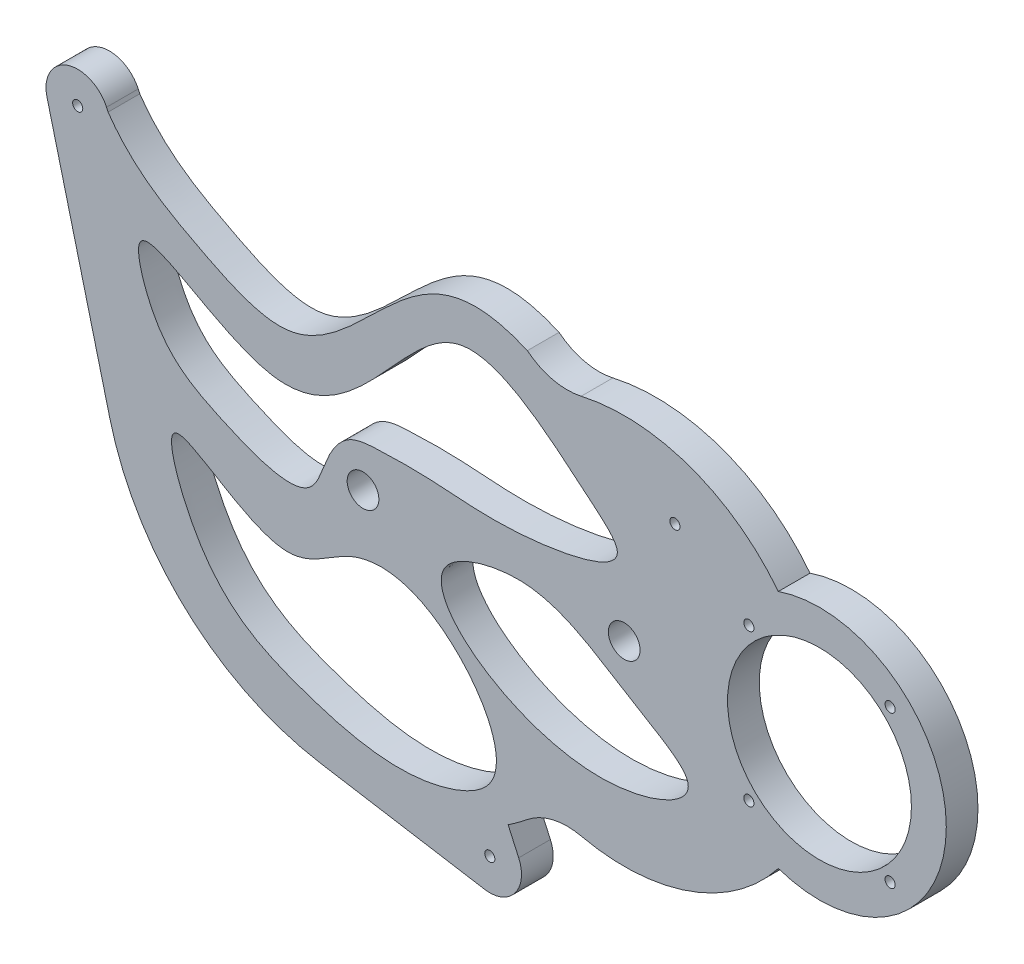
ISO-10303-21;
HEADER;
FILE_DESCRIPTION(('STEP AP214'),'2;1');
FILE_NAME('part.step','',(''),(''),'','','');
FILE_SCHEMA(('AUTOMOTIVE_DESIGN { 1 0 10303 214 1 1 1 1 }'));
ENDSEC;
DATA;
#1=APPLICATION_CONTEXT('core data for automotive mechanical design processes');
#2=APPLICATION_PROTOCOL_DEFINITION('international standard','automotive_design',2000,#1);
#3=PRODUCT_CONTEXT('',#1,'mechanical');
#4=PRODUCT('Part','Part','',(#3));
#5=PRODUCT_RELATED_PRODUCT_CATEGORY('part','',(#4));
#6=PRODUCT_DEFINITION_FORMATION('','',#4);
#7=PRODUCT_DEFINITION_CONTEXT('part definition',#1,'design');
#8=PRODUCT_DEFINITION('design','',#6,#7);
#9=PRODUCT_DEFINITION_SHAPE('','',#8);
#10=(LENGTH_UNIT() NAMED_UNIT(*) SI_UNIT(.MILLI.,.METRE.));
#11=(NAMED_UNIT(*) PLANE_ANGLE_UNIT() SI_UNIT($,.RADIAN.));
#12=(NAMED_UNIT(*) SI_UNIT($,.STERADIAN.) SOLID_ANGLE_UNIT());
#13=UNCERTAINTY_MEASURE_WITH_UNIT(LENGTH_MEASURE(1.E-05),#10,'distance_accuracy_value','');
#14=(GEOMETRIC_REPRESENTATION_CONTEXT(3) GLOBAL_UNCERTAINTY_ASSIGNED_CONTEXT((#13)) GLOBAL_UNIT_ASSIGNED_CONTEXT((#10,
#11,#12)) REPRESENTATION_CONTEXT('',''));
#15=CARTESIAN_POINT('',(0.,0.,0.));
#16=DIRECTION('',(0.,0.,1.));
#17=DIRECTION('',(1.,0.,0.));
#18=AXIS2_PLACEMENT_3D('',#15,#16,#17);
#19=CARTESIAN_POINT('',(-17.528685454899,-39.7976076291534,5.));
#20=DIRECTION('',(0.,0.,1.));
#21=DIRECTION('',(1.,0.,0.));
#22=AXIS2_PLACEMENT_3D('',#19,#20,#21);
#23=PLANE('',#22);
#24=CARTESIAN_POINT('',(-26.8504930162881,0.,5.));
#25=CARTESIAN_POINT('',(-30.4313398560451,-0.272767806086923,5.));
#26=CARTESIAN_POINT('',(-46.6957414126446,-5.30062839913538,5.));
#27=CARTESIAN_POINT('',(-18.8729352142362,-26.4192882341033,5.));
#28=CARTESIAN_POINT('',(6.87116096853247,-15.4824357645147,5.));
#29=CARTESIAN_POINT('',(-11.5115396634862,-5.55917995398729,5.));
#30=CARTESIAN_POINT('',(-18.9700108727399,0.600288680693392,5.));
#31=CARTESIAN_POINT('',(-26.8504930162881,0.,5.));
#32=B_SPLINE_CURVE_WITH_KNOTS('',3,(#24,#25,#26,#27,#28,#29,#30,#31),.UNSPECIFIED.,.T.,.F.,(4,1,
1,1,1,4),(0.,0.116637025585644,0.458330959920647,0.630209335192976,0.74331323328349,1.),.UNSPECIFIED.);
#33=CARTESIAN_POINT('',(-26.8504930162881,0.,5.));
#34=VERTEX_POINT('',#33);
#35=EDGE_CURVE('E485',#34,#34,#32,.T.);
#36=ORIENTED_EDGE('',*,*,#35,.F.);
#37=EDGE_LOOP('',(#36));
#38=FACE_BOUND('',#37,.T.);
#39=CARTESIAN_POINT('',(11.1236453201046,-11.9712817455852,5.));
#40=DIRECTION('',(0.,0.,1.));
#41=DIRECTION('',(1.,0.,0.));
#42=AXIS2_PLACEMENT_3D('',#39,#40,#41);
#43=CIRCLE('',#42,0.800000000000001);
#44=CARTESIAN_POINT('',(11.9236453201046,-11.9712817455852,5.));
#45=VERTEX_POINT('',#44);
#46=EDGE_CURVE('E520',#45,#45,#43,.T.);
#47=ORIENTED_EDGE('',*,*,#46,.F.);
#48=EDGE_LOOP('',(#47));
#49=FACE_BOUND('',#48,.T.);
#50=CARTESIAN_POINT('',(-64.1467711098311,8.54288279496274,5.));
#51=CARTESIAN_POINT('',(-72.6910432962695,9.99053392240308,5.));
#52=CARTESIAN_POINT('',(-88.7376726463015,24.2534663929378,5.));
#53=CARTESIAN_POINT('',(-82.1680432285651,3.7127386160685,5.));
#54=CARTESIAN_POINT('',(-72.9101475410972,-1.43596340164782,5.));
#55=CARTESIAN_POINT('',(-57.6183746432288,-7.46634157918555,5.));
#56=CARTESIAN_POINT('',(-55.6239805911023,2.14731006537722,5.));
#57=CARTESIAN_POINT('',(-52.0057855075501,6.51525798814292,5.));
#58=CARTESIAN_POINT('',(-46.7467705202138,6.76018995762685,5.));
#59=CARTESIAN_POINT('',(-36.8994255250369,7.01554949439911,5.));
#60=CARTESIAN_POINT('',(-27.0746098883865,5.03840880688376,5.));
#61=CARTESIAN_POINT('',(-5.7221415102765,9.62242480848327,5.));
#62=CARTESIAN_POINT('',(-19.1218633697567,20.955235960292,5.));
#63=CARTESIAN_POINT('',(-39.2229121429232,38.3176553393299,5.));
#64=CARTESIAN_POINT('',(-50.6171640405433,6.25056924264324,5.));
#65=CARTESIAN_POINT('',(-64.1467711098311,8.54288279496274,5.));
#66=B_SPLINE_CURVE_WITH_KNOTS('',3,(#50,#51,#52,#53,#54,#55,#56,#57,#58,#59,#60,#61,#62,#63,#64,
#65),.UNSPECIFIED.,.T.,.F.,(4,1,1,1,1,1,1,1,1,1,1,1,1,4),(0.,0.124196136636918,
0.177432750332984,0.253962619146952,0.332106800932268,0.369145494938121,0.395898758494909,
0.421744334966486,0.453106213471511,0.559647016610827,0.637461705132348,0.670003261575509,
0.803339021562525,1.),.UNSPECIFIED.);
#67=CARTESIAN_POINT('',(-64.1467711098311,8.54288279496274,5.));
#68=VERTEX_POINT('',#67);
#69=EDGE_CURVE('E383',#68,#68,#66,.T.);
#70=ORIENTED_EDGE('',*,*,#69,.F.);
#71=EDGE_LOOP('',(#70));
#72=FACE_BOUND('',#71,.T.);
#73=CARTESIAN_POINT('',(-0.540335940335947,20.,5.));
#74=DIRECTION('',(0.,0.,1.));
#75=DIRECTION('',(1.,0.,0.));
#76=AXIS2_PLACEMENT_3D('',#73,#74,#75);
#77=CIRCLE('',#76,0.799999999999999);
#78=CARTESIAN_POINT('',(0.259664059664052,20.,5.));
#79=VERTEX_POINT('',#78);
#80=EDGE_CURVE('E371',#79,#79,#77,.T.);
#81=ORIENTED_EDGE('',*,*,#80,.F.);
#82=EDGE_LOOP('',(#81));
#83=FACE_BOUND('',#82,.T.);
#84=CARTESIAN_POINT('',(-94.740335940336,30.,5.));
#85=DIRECTION('',(0.,0.,1.));
#86=DIRECTION('',(1.,0.,0.));
#87=AXIS2_PLACEMENT_3D('',#84,#85,#86);
#88=CIRCLE('',#87,0.799999999999995);
#89=CARTESIAN_POINT('',(-93.940335940336,30.,5.));
#90=VERTEX_POINT('',#89);
#91=EDGE_CURVE('E359',#90,#90,#88,.T.);
#92=ORIENTED_EDGE('',*,*,#91,.F.);
#93=EDGE_LOOP('',(#92));
#94=FACE_BOUND('',#93,.T.);
#95=CARTESIAN_POINT('',(-49.7403359403359,0.,5.));
#96=DIRECTION('',(0.,0.,1.));
#97=DIRECTION('',(1.,0.,0.));
#98=AXIS2_PLACEMENT_3D('',#95,#96,#97);
#99=CIRCLE('',#98,2.5);
#100=CARTESIAN_POINT('',(-47.2403359403359,0.,5.));
#101=VERTEX_POINT('',#100);
#102=EDGE_CURVE('E347',#101,#101,#99,.T.);
#103=ORIENTED_EDGE('',*,*,#102,.F.);
#104=EDGE_LOOP('',(#103));
#105=FACE_BOUND('',#104,.T.);
#106=CARTESIAN_POINT('',(-17.528685454899,-39.7976076291534,5.));
#107=DIRECTION('',(0.,0.,-1.));
#108=DIRECTION('',(1.,0.,0.));
#109=AXIS2_PLACEMENT_3D('',#106,#107,#108);
#110=CIRCLE('',#109,10.);
#111=CARTESIAN_POINT('',(-23.820023440336,-32.0246373890844,5.));
#112=VERTEX_POINT('',#111);
#113=CARTESIAN_POINT('',(-15.3256586130944,-30.0432920337727,5.));
#114=VERTEX_POINT('',#113);
#115=EDGE_CURVE('E198',#112,#114,#110,.T.);
#116=ORIENTED_EDGE('',*,*,#115,.T.);
#117=CARTESIAN_POINT('',(-8.54033594033594,0.,5.));
#118=DIRECTION('',(0.,0.,1.));
#119=DIRECTION('',(1.,0.,0.));
#120=AXIS2_PLACEMENT_3D('',#117,#118,#119);
#121=CIRCLE('',#120,30.8);
#122=CARTESIAN_POINT('',(15.7661575661576,-18.9165106036708,5.));
#123=VERTEX_POINT('',#122);
#124=EDGE_CURVE('E110',#114,#123,#121,.T.);
#125=ORIENTED_EDGE('',*,*,#124,.T.);
#126=CARTESIAN_POINT('',(22.2596640596641,0.,5.));
#127=DIRECTION('',(0.,0.,1.));
#128=DIRECTION('',(1.,0.,0.));
#129=AXIS2_PLACEMENT_3D('',#126,#127,#128);
#130=CIRCLE('',#129,20.);
#131=CARTESIAN_POINT('',(15.7661575661576,18.9165106036708,5.));
#132=VERTEX_POINT('',#131);
#133=EDGE_CURVE('E231',#123,#132,#130,.T.);
#134=ORIENTED_EDGE('',*,*,#133,.T.);
#135=CARTESIAN_POINT('',(-8.54033594033594,0.,5.));
#136=DIRECTION('',(0.,0.,1.));
#137=DIRECTION('',(1.,0.,0.));
#138=AXIS2_PLACEMENT_3D('',#135,#136,#137);
#139=CIRCLE('',#138,30.8);
#140=CARTESIAN_POINT('',(-15.3256586130944,30.0432920337727,5.));
#141=VERTEX_POINT('',#140);
#142=EDGE_CURVE('E250',#132,#141,#139,.T.);
#143=ORIENTED_EDGE('',*,*,#142,.T.);
#144=CARTESIAN_POINT('',(-17.528685454899,39.7976076291534,5.));
#145=DIRECTION('',(0.,0.,-1.));
#146=DIRECTION('',(-1.,0.,0.));
#147=AXIS2_PLACEMENT_3D('',#144,#145,#146);
#148=CIRCLE('',#147,10.);
#149=CARTESIAN_POINT('',(-23.8200234403359,32.0246373890844,5.));
#150=VERTEX_POINT('',#149);
#151=EDGE_CURVE('E247',#141,#150,#148,.T.);
#152=ORIENTED_EDGE('',*,*,#151,.T.);
#153=CARTESIAN_POINT('',(-23.8200234403359,32.0246373890844,5.));
#154=CARTESIAN_POINT('',(-35.7110783145291,37.2488635862467,5.));
#155=CARTESIAN_POINT('',(-45.0949397811192,27.5523316520246,5.));
#156=CARTESIAN_POINT('',(-60.7718586444161,12.868770100265,5.));
#157=CARTESIAN_POINT('',(-77.2412146093378,20.8488605078036,5.));
#158=CARTESIAN_POINT('',(-85.9622145574652,25.8015943996771,5.));
#159=CARTESIAN_POINT('',(-89.9454242025293,31.5375559808047,5.));
#160=B_SPLINE_CURVE_WITH_KNOTS('',3,(#153,#154,#155,#156,#157,#158,#159),.UNSPECIFIED.,.F.,.F.,
(4,1,1,1,4),(0.,0.366694163283199,0.563098477720558,0.751963115240076,1.),.UNSPECIFIED.);
#161=CARTESIAN_POINT('',(-89.9454242025293,31.5375559808047,5.));
#162=VERTEX_POINT('',#161);
#163=EDGE_CURVE('E249',#150,#162,#160,.T.);
#164=ORIENTED_EDGE('',*,*,#163,.T.);
#165=DIRECTION('',(-0.415918170473127,0.909402042811807,0.));
#166=VECTOR('',#165,1.);
#167=CARTESIAN_POINT('',(-90.1933257262769,32.0795908523655,5.));
#168=LINE('',#167,#166);
#169=CARTESIAN_POINT('',(-90.1933257262769,32.0795908523655,5.));
#170=VERTEX_POINT('',#169);
#171=EDGE_CURVE('E252',#162,#170,#168,.T.);
#172=ORIENTED_EDGE('',*,*,#171,.T.);
#173=CARTESIAN_POINT('',(-94.740335940336,30.,5.));
#174=DIRECTION('',(0.,0.,1.));
#175=DIRECTION('',(1.,0.,0.));
#176=AXIS2_PLACEMENT_3D('',#173,#174,#175);
#177=CIRCLE('',#176,5.);
#178=CARTESIAN_POINT('',(-99.5855455722991,28.7655188853887,5.));
#179=VERTEX_POINT('',#178);
#180=EDGE_CURVE('E331',#170,#179,#177,.T.);
#181=ORIENTED_EDGE('',*,*,#180,.T.);
#182=DIRECTION('',(0.246896222922263,-0.96904192639262,0.));
#183=VECTOR('',#182,1.);
#184=CARTESIAN_POINT('',(-97.1991042098857,19.3989854176647,5.));
#185=LINE('',#184,#183);
#186=CARTESIAN_POINT('',(-89.6648633077119,-10.1721243843973,5.));
#187=VERTEX_POINT('',#186);
#188=EDGE_CURVE('E328',#179,#187,#185,.T.);
#189=ORIENTED_EDGE('',*,*,#188,.T.);
#190=CARTESIAN_POINT('',(-49.7403359403359,0.,5.));
#191=DIRECTION('',(0.,0.,1.));
#192=DIRECTION('',(1.,0.,0.));
#193=AXIS2_PLACEMENT_3D('',#190,#191,#192);
#194=CIRCLE('',#193,41.2);
#195=CARTESIAN_POINT('',(-56.463742912393,-40.6477034860285,5.));
#196=VERTEX_POINT('',#195);
#197=EDGE_CURVE('E330',#187,#196,#194,.T.);
#198=ORIENTED_EDGE('',*,*,#197,.T.);
#199=DIRECTION('',(0.986594744806517,-0.163189489613035,0.));
#200=VECTOR('',#199,1.);
#201=CARTESIAN_POINT('',(-30.5562833884011,-44.9329737240326,5.));
#202=LINE('',#201,#200);
#203=CARTESIAN_POINT('',(-30.5562833884011,-44.9329737240326,5.));
#204=VERTEX_POINT('',#203);
#205=EDGE_CURVE('E147',#196,#204,#202,.T.);
#206=ORIENTED_EDGE('',*,*,#205,.T.);
#207=CARTESIAN_POINT('',(-29.7403359403359,-40.,5.));
#208=DIRECTION('',(0.,0.,1.));
#209=DIRECTION('',(1.,0.,0.));
#210=AXIS2_PLACEMENT_3D('',#207,#208,#209);
#211=CIRCLE('',#210,5.);
#212=CARTESIAN_POINT('',(-25.1846325045716,-37.9395228209551,5.));
#213=VERTEX_POINT('',#212);
#214=EDGE_CURVE('E141',#204,#213,#211,.T.);
#215=ORIENTED_EDGE('',*,*,#214,.T.);
#216=DIRECTION('',(-0.412095435808978,0.911140687152872,0.));
#217=VECTOR('',#216,1.);
#218=CARTESIAN_POINT('',(-25.1846325045716,-37.9395228209551,5.));
#219=LINE('',#218,#217);
#220=CARTESIAN_POINT('',(-26.8504930162881,-34.2563146136945,5.));
#221=VERTEX_POINT('',#220);
#222=EDGE_CURVE('E145',#213,#221,#219,.T.);
#223=ORIENTED_EDGE('',*,*,#222,.T.);
#224=CARTESIAN_POINT('',(-49.7403359403359,0.,5.));
#225=DIRECTION('',(0.,0.,1.));
#226=DIRECTION('',(1.,0.,0.));
#227=AXIS2_PLACEMENT_3D('',#224,#225,#226);
#228=CIRCLE('',#227,41.2);
#229=EDGE_CURVE('E49',#221,#112,#228,.T.);
#230=ORIENTED_EDGE('',*,*,#229,.T.);
#231=EDGE_LOOP('',(#116,#125,#134,#143,#152,#164,#172,#181,#189,#198,#206,#215,#223,#230));
#232=FACE_BOUND('',#231,.T.);
#233=CARTESIAN_POINT('',(22.2596640596641,0.,5.));
#234=DIRECTION('',(0.,0.,1.));
#235=DIRECTION('',(1.,0.,0.));
#236=AXIS2_PLACEMENT_3D('',#233,#234,#235);
#237=CIRCLE('',#236,14.5);
#238=CARTESIAN_POINT('',(36.7596640596641,0.,5.));
#239=VERTEX_POINT('',#238);
#240=EDGE_CURVE('E169',#239,#239,#237,.T.);
#241=ORIENTED_EDGE('',*,*,#240,.F.);
#242=EDGE_LOOP('',(#241));
#243=FACE_BOUND('',#242,.T.);
#244=CARTESIAN_POINT('',(-8.54033594033594,0.,5.));
#245=DIRECTION('',(0.,0.,1.));
#246=DIRECTION('',(1.,0.,0.));
#247=AXIS2_PLACEMENT_3D('',#244,#245,#246);
#248=CIRCLE('',#247,2.5);
#249=CARTESIAN_POINT('',(-6.04033594033594,0.,5.));
#250=VERTEX_POINT('',#249);
#251=EDGE_CURVE('E353',#250,#250,#248,.T.);
#252=ORIENTED_EDGE('',*,*,#251,.F.);
#253=EDGE_LOOP('',(#252));
#254=FACE_BOUND('',#253,.T.);
#255=CARTESIAN_POINT('',(-29.7403359403359,-40.,5.));
#256=DIRECTION('',(0.,0.,1.));
#257=DIRECTION('',(1.,0.,0.));
#258=AXIS2_PLACEMENT_3D('',#255,#256,#257);
#259=CIRCLE('',#258,0.8);
#260=CARTESIAN_POINT('',(-28.9403359403359,-40.,5.));
#261=VERTEX_POINT('',#260);
#262=EDGE_CURVE('E365',#261,#261,#259,.T.);
#263=ORIENTED_EDGE('',*,*,#262,.F.);
#264=EDGE_LOOP('',(#263));
#265=FACE_BOUND('',#264,.T.);
#266=CARTESIAN_POINT('',(33.3956827992235,11.9712817455852,5.));
#267=DIRECTION('',(0.,0.,1.));
#268=DIRECTION('',(1.,0.,0.));
#269=AXIS2_PLACEMENT_3D('',#266,#267,#268);
#270=CIRCLE('',#269,0.800000000000002);
#271=CARTESIAN_POINT('',(34.1956827992235,11.9712817455852,5.));
#272=VERTEX_POINT('',#271);
#273=EDGE_CURVE('E377',#272,#272,#270,.T.);
#274=ORIENTED_EDGE('',*,*,#273,.F.);
#275=EDGE_LOOP('',(#274));
#276=FACE_BOUND('',#275,.T.);
#277=CARTESIAN_POINT('',(11.1236453201046,11.9712817455852,5.));
#278=DIRECTION('',(0.,0.,1.));
#279=DIRECTION('',(1.,0.,0.));
#280=AXIS2_PLACEMENT_3D('',#277,#278,#279);
#281=CIRCLE('',#280,0.800000000000001);
#282=CARTESIAN_POINT('',(11.9236453201046,11.9712817455852,5.));
#283=VERTEX_POINT('',#282);
#284=EDGE_CURVE('E391',#283,#283,#281,.T.);
#285=ORIENTED_EDGE('',*,*,#284,.F.);
#286=EDGE_LOOP('',(#285));
#287=FACE_BOUND('',#286,.T.);
#288=CARTESIAN_POINT('',(33.3956827992235,-11.9712817455852,5.));
#289=DIRECTION('',(0.,0.,1.));
#290=DIRECTION('',(1.,0.,0.));
#291=AXIS2_PLACEMENT_3D('',#288,#289,#290);
#292=CIRCLE('',#291,0.800000000000002);
#293=CARTESIAN_POINT('',(34.1956827992235,-11.9712817455852,5.));
#294=VERTEX_POINT('',#293);
#295=EDGE_CURVE('E521',#294,#294,#292,.T.);
#296=ORIENTED_EDGE('',*,*,#295,.F.);
#297=EDGE_LOOP('',(#296));
#298=FACE_BOUND('',#297,.T.);
#299=CARTESIAN_POINT('',(-79.5553138035874,-7.12279815236433,5.));
#300=CARTESIAN_POINT('',(-80.9376559253458,-8.47097952139626,5.));
#301=CARTESIAN_POINT('',(-74.7600583607049,-25.5672733456884,5.));
#302=CARTESIAN_POINT('',(-59.0965665943954,-32.7658077985454,5.));
#303=CARTESIAN_POINT('',(-42.0384317219046,-36.9973059997225,5.));
#304=CARTESIAN_POINT('',(-23.0127481759602,-28.4605567338842,5.));
#305=CARTESIAN_POINT('',(-36.9610048837127,-8.72503312508079,5.));
#306=CARTESIAN_POINT('',(-52.2801862590822,-8.68636038022095,5.));
#307=CARTESIAN_POINT('',(-62.9177809034229,-19.5532641767408,5.));
#308=CARTESIAN_POINT('',(-77.6415202971375,-5.2562987460611,5.));
#309=CARTESIAN_POINT('',(-79.5553138035874,-7.12279815236433,5.));
#310=B_SPLINE_CURVE_WITH_KNOTS('',3,(#299,#300,#301,#302,#303,#304,#305,#306,#307,#308,#309),
.UNSPECIFIED.,.T.,.F.,(4,1,1,1,1,1,1,1,4),(0.,0.110111180505413,0.263712533404853,
0.437271091659173,0.504080637177382,0.684643032732071,0.763914810053791,0.847555783100402,1.),.UNSPECIFIED.);
#311=CARTESIAN_POINT('',(-79.5553138035874,-7.12279815236433,5.));
#312=VERTEX_POINT('',#311);
#313=EDGE_CURVE('E475',#312,#312,#310,.T.);
#314=ORIENTED_EDGE('',*,*,#313,.F.);
#315=EDGE_LOOP('',(#314));
#316=FACE_BOUND('',#315,.T.);
#317=ADVANCED_FACE('F32',(#38,#49,#72,#83,#94,#105,#232,#243,#254,#265,#276,#287,#298,#316),#23,.T.);
#318=CARTESIAN_POINT('',(-17.528685454899,-39.7976076291534,0.));
#319=DIRECTION('',(0.,0.,1.));
#320=DIRECTION('',(1.,0.,0.));
#321=AXIS2_PLACEMENT_3D('',#318,#319,#320);
#322=PLANE('',#321);
#323=CARTESIAN_POINT('',(-17.528685454899,-39.7976076291534,0.));
#324=DIRECTION('',(0.,0.,-1.));
#325=DIRECTION('',(1.,0.,0.));
#326=AXIS2_PLACEMENT_3D('',#323,#324,#325);
#327=CIRCLE('',#326,10.);
#328=CARTESIAN_POINT('',(-23.820023440336,-32.0246373890844,0.));
#329=VERTEX_POINT('',#328);
#330=CARTESIAN_POINT('',(-15.3256586130944,-30.0432920337727,0.));
#331=VERTEX_POINT('',#330);
#332=EDGE_CURVE('E165',#329,#331,#327,.T.);
#333=ORIENTED_EDGE('',*,*,#332,.F.);
#334=CARTESIAN_POINT('',(-49.7403359403359,0.,0.));
#335=DIRECTION('',(0.,0.,1.));
#336=DIRECTION('',(1.,0.,0.));
#337=AXIS2_PLACEMENT_3D('',#334,#335,#336);
#338=CIRCLE('',#337,41.2);
#339=CARTESIAN_POINT('',(-26.8504930162881,-34.2563146136945,0.));
#340=VERTEX_POINT('',#339);
#341=EDGE_CURVE('E102',#340,#329,#338,.T.);
#342=ORIENTED_EDGE('',*,*,#341,.F.);
#343=DIRECTION('',(-0.412095435808978,0.911140687152872,0.));
#344=VECTOR('',#343,1.);
#345=CARTESIAN_POINT('',(-25.1846325045716,-37.9395228209551,0.));
#346=LINE('',#345,#344);
#347=CARTESIAN_POINT('',(-25.1846325045716,-37.9395228209551,0.));
#348=VERTEX_POINT('',#347);
#349=EDGE_CURVE('E96',#348,#340,#346,.T.);
#350=ORIENTED_EDGE('',*,*,#349,.F.);
#351=CARTESIAN_POINT('',(-29.7403359403359,-40.,0.));
#352=DIRECTION('',(0.,0.,1.));
#353=DIRECTION('',(1.,0.,0.));
#354=AXIS2_PLACEMENT_3D('',#351,#352,#353);
#355=CIRCLE('',#354,5.);
#356=CARTESIAN_POINT('',(-30.5562833884011,-44.9329737240326,0.));
#357=VERTEX_POINT('',#356);
#358=EDGE_CURVE('E155',#357,#348,#355,.T.);
#359=ORIENTED_EDGE('',*,*,#358,.F.);
#360=DIRECTION('',(0.986594744806517,-0.163189489613035,0.));
#361=VECTOR('',#360,1.);
#362=CARTESIAN_POINT('',(-30.5562833884011,-44.9329737240326,0.));
#363=LINE('',#362,#361);
#364=CARTESIAN_POINT('',(-56.463742912393,-40.6477034860285,0.));
#365=VERTEX_POINT('',#364);
#366=EDGE_CURVE('E193',#365,#357,#363,.T.);
#367=ORIENTED_EDGE('',*,*,#366,.F.);
#368=CARTESIAN_POINT('',(-49.7403359403359,0.,0.));
#369=DIRECTION('',(0.,0.,1.));
#370=DIRECTION('',(1.,0.,0.));
#371=AXIS2_PLACEMENT_3D('',#368,#369,#370);
#372=CIRCLE('',#371,41.2);
#373=CARTESIAN_POINT('',(-89.6648633077119,-10.1721243843973,0.));
#374=VERTEX_POINT('',#373);
#375=EDGE_CURVE('E191',#374,#365,#372,.T.);
#376=ORIENTED_EDGE('',*,*,#375,.F.);
#377=DIRECTION('',(0.246896222922264,-0.96904192639262,0.));
#378=VECTOR('',#377,1.);
#379=CARTESIAN_POINT('',(-97.1991042098857,19.3989854176647,0.));
#380=LINE('',#379,#378);
#381=CARTESIAN_POINT('',(-99.5855455722991,28.7655188853887,0.));
#382=VERTEX_POINT('',#381);
#383=EDGE_CURVE('E189',#382,#374,#380,.T.);
#384=ORIENTED_EDGE('',*,*,#383,.F.);
#385=CARTESIAN_POINT('',(-94.740335940336,30.,0.));
#386=DIRECTION('',(0.,0.,1.));
#387=DIRECTION('',(1.,0.,0.));
#388=AXIS2_PLACEMENT_3D('',#385,#386,#387);
#389=CIRCLE('',#388,5.);
#390=CARTESIAN_POINT('',(-90.1933257262769,32.0795908523655,0.));
#391=VERTEX_POINT('',#390);
#392=EDGE_CURVE('E186',#391,#382,#389,.T.);
#393=ORIENTED_EDGE('',*,*,#392,.F.);
#394=DIRECTION('',(-0.415918170473127,0.909402042811807,0.));
#395=VECTOR('',#394,1.);
#396=CARTESIAN_POINT('',(-90.1933257262769,32.0795908523655,0.));
#397=LINE('',#396,#395);
#398=CARTESIAN_POINT('',(-89.9454242025293,31.5375559808047,0.));
#399=VERTEX_POINT('',#398);
#400=EDGE_CURVE('E181',#399,#391,#397,.T.);
#401=ORIENTED_EDGE('',*,*,#400,.F.);
#402=CARTESIAN_POINT('',(-23.8200234403359,32.0246373890844,0.));
#403=CARTESIAN_POINT('',(-35.7110783145291,37.2488635862467,0.));
#404=CARTESIAN_POINT('',(-45.0949397811192,27.5523316520246,0.));
#405=CARTESIAN_POINT('',(-60.7718586444161,12.868770100265,0.));
#406=CARTESIAN_POINT('',(-77.2412146093378,20.8488605078036,0.));
#407=CARTESIAN_POINT('',(-85.9622145574652,25.8015943996771,0.));
#408=CARTESIAN_POINT('',(-89.9454242025293,31.5375559808047,0.));
#409=B_SPLINE_CURVE_WITH_KNOTS('',3,(#402,#403,#404,#405,#406,#407,#408),.UNSPECIFIED.,.F.,.F.,
(4,1,1,1,4),(0.,0.366694163283199,0.563098477720558,0.751963115240076,1.),.UNSPECIFIED.);
#410=CARTESIAN_POINT('',(-23.8200234403359,32.0246373890844,0.));
#411=VERTEX_POINT('',#410);
#412=EDGE_CURVE('E177',#411,#399,#409,.T.);
#413=ORIENTED_EDGE('',*,*,#412,.F.);
#414=CARTESIAN_POINT('',(-17.528685454899,39.7976076291534,0.));
#415=DIRECTION('',(0.,0.,-1.));
#416=DIRECTION('',(-1.,0.,0.));
#417=AXIS2_PLACEMENT_3D('',#414,#415,#416);
#418=CIRCLE('',#417,10.);
#419=CARTESIAN_POINT('',(-15.3256586130944,30.0432920337727,0.));
#420=VERTEX_POINT('',#419);
#421=EDGE_CURVE('E175',#420,#411,#418,.T.);
#422=ORIENTED_EDGE('',*,*,#421,.F.);
#423=CARTESIAN_POINT('',(-8.54033594033594,0.,0.));
#424=DIRECTION('',(0.,0.,1.));
#425=DIRECTION('',(1.,0.,0.));
#426=AXIS2_PLACEMENT_3D('',#423,#424,#425);
#427=CIRCLE('',#426,30.8);
#428=CARTESIAN_POINT('',(15.7661575661576,18.9165106036708,0.));
#429=VERTEX_POINT('',#428);
#430=EDGE_CURVE('E173',#429,#420,#427,.T.);
#431=ORIENTED_EDGE('',*,*,#430,.F.);
#432=CARTESIAN_POINT('',(22.2596640596641,0.,0.));
#433=DIRECTION('',(0.,0.,1.));
#434=DIRECTION('',(1.,0.,0.));
#435=AXIS2_PLACEMENT_3D('',#432,#433,#434);
#436=CIRCLE('',#435,20.);
#437=CARTESIAN_POINT('',(15.7661575661576,-18.9165106036708,0.));
#438=VERTEX_POINT('',#437);
#439=EDGE_CURVE('E171',#438,#429,#436,.T.);
#440=ORIENTED_EDGE('',*,*,#439,.F.);
#441=CARTESIAN_POINT('',(-8.54033594033594,0.,0.));
#442=DIRECTION('',(0.,0.,1.));
#443=DIRECTION('',(1.,0.,0.));
#444=AXIS2_PLACEMENT_3D('',#441,#442,#443);
#445=CIRCLE('',#444,30.8);
#446=EDGE_CURVE('E168',#331,#438,#445,.T.);
#447=ORIENTED_EDGE('',*,*,#446,.F.);
#448=EDGE_LOOP('',(#333,#342,#350,#359,#367,#376,#384,#393,#401,#413,#422,#431,#440,#447));
#449=FACE_BOUND('',#448,.T.);
#450=CARTESIAN_POINT('',(22.2596640596641,0.,0.));
#451=DIRECTION('',(0.,0.,1.));
#452=DIRECTION('',(1.,0.,0.));
#453=AXIS2_PLACEMENT_3D('',#450,#451,#452);
#454=CIRCLE('',#453,14.5);
#455=CARTESIAN_POINT('',(36.7596640596641,0.,0.));
#456=VERTEX_POINT('',#455);
#457=EDGE_CURVE('E344',#456,#456,#454,.T.);
#458=ORIENTED_EDGE('',*,*,#457,.T.);
#459=EDGE_LOOP('',(#458));
#460=FACE_BOUND('',#459,.T.);
#461=CARTESIAN_POINT('',(-49.7403359403359,0.,0.));
#462=DIRECTION('',(0.,0.,1.));
#463=DIRECTION('',(1.,0.,0.));
#464=AXIS2_PLACEMENT_3D('',#461,#462,#463);
#465=CIRCLE('',#464,2.5);
#466=CARTESIAN_POINT('',(-47.2403359403359,0.,0.));
#467=VERTEX_POINT('',#466);
#468=EDGE_CURVE('E350',#467,#467,#465,.T.);
#469=ORIENTED_EDGE('',*,*,#468,.T.);
#470=EDGE_LOOP('',(#469));
#471=FACE_BOUND('',#470,.T.);
#472=CARTESIAN_POINT('',(-8.54033594033594,0.,0.));
#473=DIRECTION('',(0.,0.,1.));
#474=DIRECTION('',(1.,0.,0.));
#475=AXIS2_PLACEMENT_3D('',#472,#473,#474);
#476=CIRCLE('',#475,2.5);
#477=CARTESIAN_POINT('',(-6.04033594033594,0.,0.));
#478=VERTEX_POINT('',#477);
#479=EDGE_CURVE('E356',#478,#478,#476,.T.);
#480=ORIENTED_EDGE('',*,*,#479,.T.);
#481=EDGE_LOOP('',(#480));
#482=FACE_BOUND('',#481,.T.);
#483=CARTESIAN_POINT('',(-94.740335940336,30.,0.));
#484=DIRECTION('',(0.,0.,1.));
#485=DIRECTION('',(1.,0.,0.));
#486=AXIS2_PLACEMENT_3D('',#483,#484,#485);
#487=CIRCLE('',#486,0.799999999999995);
#488=CARTESIAN_POINT('',(-93.940335940336,30.,0.));
#489=VERTEX_POINT('',#488);
#490=EDGE_CURVE('E362',#489,#489,#487,.T.);
#491=ORIENTED_EDGE('',*,*,#490,.T.);
#492=EDGE_LOOP('',(#491));
#493=FACE_BOUND('',#492,.T.);
#494=CARTESIAN_POINT('',(-29.7403359403359,-40.,0.));
#495=DIRECTION('',(0.,0.,1.));
#496=DIRECTION('',(1.,0.,0.));
#497=AXIS2_PLACEMENT_3D('',#494,#495,#496);
#498=CIRCLE('',#497,0.8);
#499=CARTESIAN_POINT('',(-28.9403359403359,-40.,0.));
#500=VERTEX_POINT('',#499);
#501=EDGE_CURVE('E368',#500,#500,#498,.T.);
#502=ORIENTED_EDGE('',*,*,#501,.T.);
#503=EDGE_LOOP('',(#502));
#504=FACE_BOUND('',#503,.T.);
#505=CARTESIAN_POINT('',(-0.540335940335947,20.,0.));
#506=DIRECTION('',(0.,0.,1.));
#507=DIRECTION('',(1.,0.,0.));
#508=AXIS2_PLACEMENT_3D('',#505,#506,#507);
#509=CIRCLE('',#508,0.799999999999999);
#510=CARTESIAN_POINT('',(0.259664059664052,20.,0.));
#511=VERTEX_POINT('',#510);
#512=EDGE_CURVE('E374',#511,#511,#509,.T.);
#513=ORIENTED_EDGE('',*,*,#512,.T.);
#514=EDGE_LOOP('',(#513));
#515=FACE_BOUND('',#514,.T.);
#516=CARTESIAN_POINT('',(33.3956827992235,11.9712817455852,0.));
#517=DIRECTION('',(0.,0.,1.));
#518=DIRECTION('',(1.,0.,0.));
#519=AXIS2_PLACEMENT_3D('',#516,#517,#518);
#520=CIRCLE('',#519,0.800000000000002);
#521=CARTESIAN_POINT('',(34.1956827992235,11.9712817455852,0.));
#522=VERTEX_POINT('',#521);
#523=EDGE_CURVE('E380',#522,#522,#520,.T.);
#524=ORIENTED_EDGE('',*,*,#523,.T.);
#525=EDGE_LOOP('',(#524));
#526=FACE_BOUND('',#525,.T.);
#527=CARTESIAN_POINT('',(-64.1467711098311,8.54288279496274,0.));
#528=CARTESIAN_POINT('',(-72.6910432962695,9.99053392240308,0.));
#529=CARTESIAN_POINT('',(-88.7376726463015,24.2534663929378,0.));
#530=CARTESIAN_POINT('',(-82.1680432285651,3.7127386160685,0.));
#531=CARTESIAN_POINT('',(-72.9101475410972,-1.43596340164782,0.));
#532=CARTESIAN_POINT('',(-57.6183746432288,-7.46634157918555,0.));
#533=CARTESIAN_POINT('',(-55.6239805911023,2.14731006537722,0.));
#534=CARTESIAN_POINT('',(-52.0057855075501,6.51525798814292,0.));
#535=CARTESIAN_POINT('',(-46.7467705202138,6.76018995762685,0.));
#536=CARTESIAN_POINT('',(-36.8994255250369,7.01554949439911,0.));
#537=CARTESIAN_POINT('',(-27.0746098883865,5.03840880688376,0.));
#538=CARTESIAN_POINT('',(-5.7221415102765,9.62242480848327,0.));
#539=CARTESIAN_POINT('',(-19.1218633697567,20.955235960292,0.));
#540=CARTESIAN_POINT('',(-39.2229121429232,38.3176553393299,0.));
#541=CARTESIAN_POINT('',(-50.6171640405433,6.25056924264324,0.));
#542=CARTESIAN_POINT('',(-64.1467711098311,8.54288279496274,0.));
#543=B_SPLINE_CURVE_WITH_KNOTS('',3,(#527,#528,#529,#530,#531,#532,#533,#534,#535,#536,#537,
#538,#539,#540,#541,#542),.UNSPECIFIED.,.T.,.F.,(4,1,1,1,1,1,1,1,1,1,1,1,1,4),(0.,
0.124196136636918,0.177432750332984,0.253962619146952,0.332106800932268,0.369145494938121,
0.395898758494909,0.421744334966486,0.453106213471511,0.559647016610827,0.637461705132348,
0.670003261575509,0.803339021562525,1.),.UNSPECIFIED.);
#544=CARTESIAN_POINT('',(-64.1467711098311,8.54288279496274,0.));
#545=VERTEX_POINT('',#544);
#546=EDGE_CURVE('E386',#545,#545,#543,.T.);
#547=ORIENTED_EDGE('',*,*,#546,.T.);
#548=EDGE_LOOP('',(#547));
#549=FACE_BOUND('',#548,.T.);
#550=CARTESIAN_POINT('',(11.1236453201046,11.9712817455852,0.));
#551=DIRECTION('',(0.,0.,1.));
#552=DIRECTION('',(1.,0.,0.));
#553=AXIS2_PLACEMENT_3D('',#550,#551,#552);
#554=CIRCLE('',#553,0.800000000000001);
#555=CARTESIAN_POINT('',(11.9236453201046,11.9712817455852,0.));
#556=VERTEX_POINT('',#555);
#557=EDGE_CURVE('E400',#556,#556,#554,.T.);
#558=ORIENTED_EDGE('',*,*,#557,.T.);
#559=EDGE_LOOP('',(#558));
#560=FACE_BOUND('',#559,.T.);
#561=CARTESIAN_POINT('',(11.1236453201046,-11.9712817455852,0.));
#562=DIRECTION('',(0.,0.,1.));
#563=DIRECTION('',(1.,0.,0.));
#564=AXIS2_PLACEMENT_3D('',#561,#562,#563);
#565=CIRCLE('',#564,0.800000000000001);
#566=CARTESIAN_POINT('',(11.9236453201046,-11.9712817455852,0.));
#567=VERTEX_POINT('',#566);
#568=EDGE_CURVE('E462',#567,#567,#565,.T.);
#569=ORIENTED_EDGE('',*,*,#568,.T.);
#570=EDGE_LOOP('',(#569));
#571=FACE_BOUND('',#570,.T.);
#572=CARTESIAN_POINT('',(33.3956827992235,-11.9712817455852,0.));
#573=DIRECTION('',(0.,0.,1.));
#574=DIRECTION('',(1.,0.,0.));
#575=AXIS2_PLACEMENT_3D('',#572,#573,#574);
#576=CIRCLE('',#575,0.800000000000002);
#577=CARTESIAN_POINT('',(34.1956827992235,-11.9712817455852,0.));
#578=VERTEX_POINT('',#577);
#579=EDGE_CURVE('E466',#578,#578,#576,.T.);
#580=ORIENTED_EDGE('',*,*,#579,.T.);
#581=EDGE_LOOP('',(#580));
#582=FACE_BOUND('',#581,.T.);
#583=CARTESIAN_POINT('',(-26.8504930162881,0.,0.));
#584=CARTESIAN_POINT('',(-30.4313398560451,-0.272767806086923,0.));
#585=CARTESIAN_POINT('',(-46.6957414126446,-5.30062839913538,0.));
#586=CARTESIAN_POINT('',(-18.8729352142362,-26.4192882341033,0.));
#587=CARTESIAN_POINT('',(6.87116096853247,-15.4824357645147,0.));
#588=CARTESIAN_POINT('',(-11.5115396634862,-5.55917995398729,0.));
#589=CARTESIAN_POINT('',(-18.9700108727399,0.600288680693392,0.));
#590=CARTESIAN_POINT('',(-26.8504930162881,0.,0.));
#591=B_SPLINE_CURVE_WITH_KNOTS('',3,(#583,#584,#585,#586,#587,#588,#589,#590),.UNSPECIFIED.,.T.,
.F.,(4,1,1,1,1,4),(0.,0.116637025585644,0.458330959920647,0.630209335192976,0.74331323328349,
1.),.UNSPECIFIED.);
#592=CARTESIAN_POINT('',(-26.8504930162881,0.,0.));
#593=VERTEX_POINT('',#592);
#594=EDGE_CURVE('E470',#593,#593,#591,.T.);
#595=ORIENTED_EDGE('',*,*,#594,.T.);
#596=EDGE_LOOP('',(#595));
#597=FACE_BOUND('',#596,.T.);
#598=CARTESIAN_POINT('',(-79.5553138035874,-7.12279815236433,0.));
#599=CARTESIAN_POINT('',(-80.9376559253458,-8.47097952139626,0.));
#600=CARTESIAN_POINT('',(-74.7600583607049,-25.5672733456884,0.));
#601=CARTESIAN_POINT('',(-59.0965665943954,-32.7658077985454,0.));
#602=CARTESIAN_POINT('',(-42.0384317219046,-36.9973059997225,0.));
#603=CARTESIAN_POINT('',(-23.0127481759602,-28.4605567338842,0.));
#604=CARTESIAN_POINT('',(-36.9610048837127,-8.72503312508079,0.));
#605=CARTESIAN_POINT('',(-52.2801862590822,-8.68636038022095,0.));
#606=CARTESIAN_POINT('',(-62.9177809034229,-19.5532641767408,0.));
#607=CARTESIAN_POINT('',(-77.6415202971375,-5.2562987460611,0.));
#608=CARTESIAN_POINT('',(-79.5553138035874,-7.12279815236433,0.));
#609=B_SPLINE_CURVE_WITH_KNOTS('',3,(#598,#599,#600,#601,#602,#603,#604,#605,#606,#607,#608),
.UNSPECIFIED.,.T.,.F.,(4,1,1,1,1,1,1,1,4),(0.,0.110111180505413,0.263712533404853,
0.437271091659173,0.504080637177382,0.684643032732071,0.763914810053791,0.847555783100402,1.),.UNSPECIFIED.);
#610=CARTESIAN_POINT('',(-79.5553138035874,-7.12279815236433,0.));
#611=VERTEX_POINT('',#610);
#612=EDGE_CURVE('E473',#611,#611,#609,.T.);
#613=ORIENTED_EDGE('',*,*,#612,.T.);
#614=EDGE_LOOP('',(#613));
#615=FACE_BOUND('',#614,.T.);
#616=ADVANCED_FACE('F235',(#449,#460,#471,#482,#493,#504,#515,#526,#549,#560,#571,#582,#597,
#615),#322,.F.);
#617=CARTESIAN_POINT('',(-17.528685454899,-39.7976076291534,5.));
#618=DIRECTION('',(0.,0.,-1.));
#619=DIRECTION('',(-1.,0.,0.));
#620=AXIS2_PLACEMENT_3D('',#617,#618,#619);
#621=CYLINDRICAL_SURFACE('',#620,10.);
#622=ORIENTED_EDGE('',*,*,#332,.T.);
#623=DIRECTION('',(0.,0.,-1.));
#624=VECTOR('',#623,1.);
#625=CARTESIAN_POINT('',(-15.3256586130944,-30.0432920337727,5.));
#626=LINE('',#625,#624);
#627=EDGE_CURVE('E11',#114,#331,#626,.T.);
#628=ORIENTED_EDGE('',*,*,#627,.F.);
#629=ORIENTED_EDGE('',*,*,#115,.F.);
#630=DIRECTION('',(0.,0.,-1.));
#631=VECTOR('',#630,1.);
#632=CARTESIAN_POINT('',(-23.820023440336,-32.0246373890844,5.));
#633=LINE('',#632,#631);
#634=EDGE_CURVE('E161',#112,#329,#633,.T.);
#635=ORIENTED_EDGE('',*,*,#634,.T.);
#636=EDGE_LOOP('',(#622,#628,#629,#635));
#637=FACE_BOUND('',#636,.T.);
#638=ADVANCED_FACE('F34',(#637),#621,.F.);
#639=CARTESIAN_POINT('',(-8.54033594033594,0.,5.));
#640=DIRECTION('',(0.,0.,-1.));
#641=DIRECTION('',(-1.,0.,0.));
#642=AXIS2_PLACEMENT_3D('',#639,#640,#641);
#643=CYLINDRICAL_SURFACE('',#642,30.8);
#644=ORIENTED_EDGE('',*,*,#446,.T.);
#645=DIRECTION('',(0.,0.,-1.));
#646=VECTOR('',#645,1.);
#647=CARTESIAN_POINT('',(15.7661575661576,-18.9165106036708,5.));
#648=LINE('',#647,#646);
#649=EDGE_CURVE('E41',#123,#438,#648,.T.);
#650=ORIENTED_EDGE('',*,*,#649,.F.);
#651=ORIENTED_EDGE('',*,*,#124,.F.);
#652=ORIENTED_EDGE('',*,*,#627,.T.);
#653=EDGE_LOOP('',(#644,#650,#651,#652));
#654=FACE_BOUND('',#653,.T.);
#655=ADVANCED_FACE('F277',(#654),#643,.T.);
#656=CARTESIAN_POINT('',(22.2596640596641,0.,5.));
#657=DIRECTION('',(0.,0.,-1.));
#658=DIRECTION('',(-1.,0.,0.));
#659=AXIS2_PLACEMENT_3D('',#656,#657,#658);
#660=CYLINDRICAL_SURFACE('',#659,20.);
#661=ORIENTED_EDGE('',*,*,#439,.T.);
#662=DIRECTION('',(0.,0.,-1.));
#663=VECTOR('',#662,1.);
#664=CARTESIAN_POINT('',(15.7661575661576,18.9165106036708,5.));
#665=LINE('',#664,#663);
#666=EDGE_CURVE('E223',#132,#429,#665,.T.);
#667=ORIENTED_EDGE('',*,*,#666,.F.);
#668=ORIENTED_EDGE('',*,*,#133,.F.);
#669=ORIENTED_EDGE('',*,*,#649,.T.);
#670=EDGE_LOOP('',(#661,#667,#668,#669));
#671=FACE_BOUND('',#670,.T.);
#672=ADVANCED_FACE('F229',(#671),#660,.T.);
#673=CARTESIAN_POINT('',(-8.54033594033594,0.,5.));
#674=DIRECTION('',(0.,0.,-1.));
#675=DIRECTION('',(-1.,0.,0.));
#676=AXIS2_PLACEMENT_3D('',#673,#674,#675);
#677=CYLINDRICAL_SURFACE('',#676,30.8);
#678=ORIENTED_EDGE('',*,*,#430,.T.);
#679=DIRECTION('',(0.,0.,-1.));
#680=VECTOR('',#679,1.);
#681=CARTESIAN_POINT('',(-15.3256586130944,30.0432920337727,5.));
#682=LINE('',#681,#680);
#683=EDGE_CURVE('E220',#141,#420,#682,.T.);
#684=ORIENTED_EDGE('',*,*,#683,.F.);
#685=ORIENTED_EDGE('',*,*,#142,.F.);
#686=ORIENTED_EDGE('',*,*,#666,.T.);
#687=EDGE_LOOP('',(#678,#684,#685,#686));
#688=FACE_BOUND('',#687,.T.);
#689=ADVANCED_FACE('F241',(#688),#677,.T.);
#690=CARTESIAN_POINT('',(-17.528685454899,39.7976076291534,5.));
#691=DIRECTION('',(0.,0.,-1.));
#692=DIRECTION('',(-1.,0.,0.));
#693=AXIS2_PLACEMENT_3D('',#690,#691,#692);
#694=CYLINDRICAL_SURFACE('',#693,10.);
#695=ORIENTED_EDGE('',*,*,#421,.T.);
#696=DIRECTION('',(0.,0.,-1.));
#697=VECTOR('',#696,1.);
#698=CARTESIAN_POINT('',(-23.8200234403359,32.0246373890844,5.));
#699=LINE('',#698,#697);
#700=EDGE_CURVE('E217',#150,#411,#699,.T.);
#701=ORIENTED_EDGE('',*,*,#700,.F.);
#702=ORIENTED_EDGE('',*,*,#151,.F.);
#703=ORIENTED_EDGE('',*,*,#683,.T.);
#704=EDGE_LOOP('',(#695,#701,#702,#703));
#705=FACE_BOUND('',#704,.T.);
#706=ADVANCED_FACE('F245',(#705),#694,.F.);
#707=DIRECTION('',(0.,0.,-1.));
#708=VECTOR('',#707,1.);
#709=SURFACE_OF_LINEAR_EXTRUSION('',#160,#708);
#710=ORIENTED_EDGE('',*,*,#412,.T.);
#711=DIRECTION('',(0.,0.,-1.));
#712=VECTOR('',#711,1.);
#713=CARTESIAN_POINT('',(-89.9454242025293,31.5375559808047,5.));
#714=LINE('',#713,#712);
#715=EDGE_CURVE('E214',#162,#399,#714,.T.);
#716=ORIENTED_EDGE('',*,*,#715,.F.);
#717=ORIENTED_EDGE('',*,*,#163,.F.);
#718=ORIENTED_EDGE('',*,*,#700,.T.);
#719=EDGE_LOOP('',(#710,#716,#717,#718));
#720=FACE_BOUND('',#719,.T.);
#721=ADVANCED_FACE('F265',(#720),#709,.F.);
#722=CARTESIAN_POINT('',(-90.1933257262769,32.0795908523655,5.));
#723=DIRECTION('',(-0.909402042811807,-0.415918170473127,0.));
#724=DIRECTION('',(0.415918170473127,-0.909402042811807,0.));
#725=AXIS2_PLACEMENT_3D('',#722,#723,#724);
#726=PLANE('',#725);
#727=ORIENTED_EDGE('',*,*,#400,.T.);
#728=DIRECTION('',(0.,0.,-1.));
#729=VECTOR('',#728,1.);
#730=CARTESIAN_POINT('',(-90.1933257262769,32.0795908523655,5.));
#731=LINE('',#730,#729);
#732=EDGE_CURVE('E211',#170,#391,#731,.T.);
#733=ORIENTED_EDGE('',*,*,#732,.F.);
#734=ORIENTED_EDGE('',*,*,#171,.F.);
#735=ORIENTED_EDGE('',*,*,#715,.T.);
#736=EDGE_LOOP('',(#727,#733,#734,#735));
#737=FACE_BOUND('',#736,.T.);
#738=ADVANCED_FACE('F269',(#737),#726,.F.);
#739=CARTESIAN_POINT('',(-94.740335940336,30.,5.));
#740=DIRECTION('',(0.,0.,-1.));
#741=DIRECTION('',(-1.,0.,0.));
#742=AXIS2_PLACEMENT_3D('',#739,#740,#741);
#743=CYLINDRICAL_SURFACE('',#742,5.);
#744=ORIENTED_EDGE('',*,*,#392,.T.);
#745=DIRECTION('',(0.,0.,-1.));
#746=VECTOR('',#745,1.);
#747=CARTESIAN_POINT('',(-99.5855455722991,28.7655188853887,5.));
#748=LINE('',#747,#746);
#749=EDGE_CURVE('E208',#179,#382,#748,.T.);
#750=ORIENTED_EDGE('',*,*,#749,.F.);
#751=ORIENTED_EDGE('',*,*,#180,.F.);
#752=ORIENTED_EDGE('',*,*,#732,.T.);
#753=EDGE_LOOP('',(#744,#750,#751,#752));
#754=FACE_BOUND('',#753,.T.);
#755=ADVANCED_FACE('F313',(#754),#743,.T.);
#756=CARTESIAN_POINT('',(-97.1991042098857,19.3989854176647,5.));
#757=DIRECTION('',(0.96904192639262,0.246896222922264,0.));
#758=DIRECTION('',(-0.246896222922264,0.96904192639262,0.));
#759=AXIS2_PLACEMENT_3D('',#756,#757,#758);
#760=PLANE('',#759);
#761=ORIENTED_EDGE('',*,*,#383,.T.);
#762=DIRECTION('',(0.,0.,-1.));
#763=VECTOR('',#762,1.);
#764=CARTESIAN_POINT('',(-89.6648633077119,-10.1721243843973,5.));
#765=LINE('',#764,#763);
#766=EDGE_CURVE('E205',#187,#374,#765,.T.);
#767=ORIENTED_EDGE('',*,*,#766,.F.);
#768=ORIENTED_EDGE('',*,*,#188,.F.);
#769=ORIENTED_EDGE('',*,*,#749,.T.);
#770=EDGE_LOOP('',(#761,#767,#768,#769));
#771=FACE_BOUND('',#770,.T.);
#772=ADVANCED_FACE('F310',(#771),#760,.F.);
#773=CARTESIAN_POINT('',(-49.7403359403359,0.,5.));
#774=DIRECTION('',(0.,0.,-1.));
#775=DIRECTION('',(-1.,0.,0.));
#776=AXIS2_PLACEMENT_3D('',#773,#774,#775);
#777=CYLINDRICAL_SURFACE('',#776,41.2);
#778=ORIENTED_EDGE('',*,*,#375,.T.);
#779=DIRECTION('',(0.,0.,-1.));
#780=VECTOR('',#779,1.);
#781=CARTESIAN_POINT('',(-56.463742912393,-40.6477034860285,5.));
#782=LINE('',#781,#780);
#783=EDGE_CURVE('E202',#196,#365,#782,.T.);
#784=ORIENTED_EDGE('',*,*,#783,.F.);
#785=ORIENTED_EDGE('',*,*,#197,.F.);
#786=ORIENTED_EDGE('',*,*,#766,.T.);
#787=EDGE_LOOP('',(#778,#784,#785,#786));
#788=FACE_BOUND('',#787,.T.);
#789=ADVANCED_FACE('F306',(#788),#777,.T.);
#790=CARTESIAN_POINT('',(-30.5562833884011,-44.9329737240326,5.));
#791=DIRECTION('',(0.163189489613035,0.986594744806518,0.));
#792=DIRECTION('',(-0.986594744806518,0.163189489613035,0.));
#793=AXIS2_PLACEMENT_3D('',#790,#791,#792);
#794=PLANE('',#793);
#795=ORIENTED_EDGE('',*,*,#366,.T.);
#796=DIRECTION('',(0.,0.,-1.));
#797=VECTOR('',#796,1.);
#798=CARTESIAN_POINT('',(-30.5562833884011,-44.9329737240326,5.));
#799=LINE('',#798,#797);
#800=EDGE_CURVE('E156',#204,#357,#799,.T.);
#801=ORIENTED_EDGE('',*,*,#800,.F.);
#802=ORIENTED_EDGE('',*,*,#205,.F.);
#803=ORIENTED_EDGE('',*,*,#783,.T.);
#804=EDGE_LOOP('',(#795,#801,#802,#803));
#805=FACE_BOUND('',#804,.T.);
#806=ADVANCED_FACE('F303',(#805),#794,.F.);
#807=CARTESIAN_POINT('',(-29.7403359403359,-40.,5.));
#808=DIRECTION('',(0.,0.,-1.));
#809=DIRECTION('',(-1.,0.,0.));
#810=AXIS2_PLACEMENT_3D('',#807,#808,#809);
#811=CYLINDRICAL_SURFACE('',#810,5.);
#812=ORIENTED_EDGE('',*,*,#358,.T.);
#813=DIRECTION('',(0.,0.,-1.));
#814=VECTOR('',#813,1.);
#815=CARTESIAN_POINT('',(-25.1846325045716,-37.9395228209551,5.));
#816=LINE('',#815,#814);
#817=EDGE_CURVE('E152',#213,#348,#816,.T.);
#818=ORIENTED_EDGE('',*,*,#817,.F.);
#819=ORIENTED_EDGE('',*,*,#214,.F.);
#820=ORIENTED_EDGE('',*,*,#800,.T.);
#821=EDGE_LOOP('',(#812,#818,#819,#820));
#822=FACE_BOUND('',#821,.T.);
#823=ADVANCED_FACE('F153',(#822),#811,.T.);
#824=CARTESIAN_POINT('',(-25.1846325045716,-37.9395228209551,5.));
#825=DIRECTION('',(-0.911140687152872,-0.412095435808978,0.));
#826=DIRECTION('',(0.412095435808978,-0.911140687152872,0.));
#827=AXIS2_PLACEMENT_3D('',#824,#825,#826);
#828=PLANE('',#827);
#829=ORIENTED_EDGE('',*,*,#349,.T.);
#830=DIRECTION('',(0.,0.,-1.));
#831=VECTOR('',#830,1.);
#832=CARTESIAN_POINT('',(-26.8504930162881,-34.2563146136945,5.));
#833=LINE('',#832,#831);
#834=EDGE_CURVE('E157',#221,#340,#833,.T.);
#835=ORIENTED_EDGE('',*,*,#834,.F.);
#836=ORIENTED_EDGE('',*,*,#222,.F.);
#837=ORIENTED_EDGE('',*,*,#817,.T.);
#838=EDGE_LOOP('',(#829,#835,#836,#837));
#839=FACE_BOUND('',#838,.T.);
#840=ADVANCED_FACE('F159',(#839),#828,.F.);
#841=CARTESIAN_POINT('',(-49.7403359403359,0.,5.));
#842=DIRECTION('',(0.,0.,-1.));
#843=DIRECTION('',(-1.,0.,0.));
#844=AXIS2_PLACEMENT_3D('',#841,#842,#843);
#845=CYLINDRICAL_SURFACE('',#844,41.2);
#846=ORIENTED_EDGE('',*,*,#341,.T.);
#847=ORIENTED_EDGE('',*,*,#634,.F.);
#848=ORIENTED_EDGE('',*,*,#229,.F.);
#849=ORIENTED_EDGE('',*,*,#834,.T.);
#850=EDGE_LOOP('',(#846,#847,#848,#849));
#851=FACE_BOUND('',#850,.T.);
#852=ADVANCED_FACE('F296',(#851),#845,.T.);
#853=CARTESIAN_POINT('',(22.2596640596641,0.,5.));
#854=DIRECTION('',(0.,0.,-1.));
#855=DIRECTION('',(-1.,0.,0.));
#856=AXIS2_PLACEMENT_3D('',#853,#854,#855);
#857=CYLINDRICAL_SURFACE('',#856,14.5);
#858=ORIENTED_EDGE('',*,*,#240,.T.);
#859=EDGE_LOOP('',(#858));
#860=FACE_BOUND('',#859,.T.);
#861=ORIENTED_EDGE('',*,*,#457,.F.);
#862=EDGE_LOOP('',(#861));
#863=FACE_BOUND('',#862,.T.);
#864=ADVANCED_FACE('F293',(#860,#863),#857,.F.);
#865=CARTESIAN_POINT('',(-49.7403359403359,0.,5.));
#866=DIRECTION('',(0.,0.,-1.));
#867=DIRECTION('',(-1.,0.,0.));
#868=AXIS2_PLACEMENT_3D('',#865,#866,#867);
#869=CYLINDRICAL_SURFACE('',#868,2.5);
#870=ORIENTED_EDGE('',*,*,#102,.T.);
#871=EDGE_LOOP('',(#870));
#872=FACE_BOUND('',#871,.T.);
#873=ORIENTED_EDGE('',*,*,#468,.F.);
#874=EDGE_LOOP('',(#873));
#875=FACE_BOUND('',#874,.T.);
#876=ADVANCED_FACE('F431',(#872,#875),#869,.F.);
#877=CARTESIAN_POINT('',(-8.54033594033594,0.,5.));
#878=DIRECTION('',(0.,0.,-1.));
#879=DIRECTION('',(-1.,0.,0.));
#880=AXIS2_PLACEMENT_3D('',#877,#878,#879);
#881=CYLINDRICAL_SURFACE('',#880,2.5);
#882=ORIENTED_EDGE('',*,*,#251,.T.);
#883=EDGE_LOOP('',(#882));
#884=FACE_BOUND('',#883,.T.);
#885=ORIENTED_EDGE('',*,*,#479,.F.);
#886=EDGE_LOOP('',(#885));
#887=FACE_BOUND('',#886,.T.);
#888=ADVANCED_FACE('F428',(#884,#887),#881,.F.);
#889=CARTESIAN_POINT('',(-94.740335940336,30.,5.));
#890=DIRECTION('',(0.,0.,-1.));
#891=DIRECTION('',(-1.,0.,0.));
#892=AXIS2_PLACEMENT_3D('',#889,#890,#891);
#893=CYLINDRICAL_SURFACE('',#892,0.799999999999995);
#894=ORIENTED_EDGE('',*,*,#91,.T.);
#895=EDGE_LOOP('',(#894));
#896=FACE_BOUND('',#895,.T.);
#897=ORIENTED_EDGE('',*,*,#490,.F.);
#898=EDGE_LOOP('',(#897));
#899=FACE_BOUND('',#898,.T.);
#900=ADVANCED_FACE('F424',(#896,#899),#893,.F.);
#901=CARTESIAN_POINT('',(-29.7403359403359,-40.,5.));
#902=DIRECTION('',(0.,0.,-1.));
#903=DIRECTION('',(-1.,0.,0.));
#904=AXIS2_PLACEMENT_3D('',#901,#902,#903);
#905=CYLINDRICAL_SURFACE('',#904,0.8);
#906=ORIENTED_EDGE('',*,*,#262,.T.);
#907=EDGE_LOOP('',(#906));
#908=FACE_BOUND('',#907,.T.);
#909=ORIENTED_EDGE('',*,*,#501,.F.);
#910=EDGE_LOOP('',(#909));
#911=FACE_BOUND('',#910,.T.);
#912=ADVANCED_FACE('F420',(#908,#911),#905,.F.);
#913=CARTESIAN_POINT('',(-0.540335940335947,20.,5.));
#914=DIRECTION('',(0.,0.,-1.));
#915=DIRECTION('',(-1.,0.,0.));
#916=AXIS2_PLACEMENT_3D('',#913,#914,#915);
#917=CYLINDRICAL_SURFACE('',#916,0.799999999999999);
#918=ORIENTED_EDGE('',*,*,#80,.T.);
#919=EDGE_LOOP('',(#918));
#920=FACE_BOUND('',#919,.T.);
#921=ORIENTED_EDGE('',*,*,#512,.F.);
#922=EDGE_LOOP('',(#921));
#923=FACE_BOUND('',#922,.T.);
#924=ADVANCED_FACE('F416',(#920,#923),#917,.F.);
#925=CARTESIAN_POINT('',(33.3956827992235,11.9712817455852,5.));
#926=DIRECTION('',(0.,0.,-1.));
#927=DIRECTION('',(-1.,0.,0.));
#928=AXIS2_PLACEMENT_3D('',#925,#926,#927);
#929=CYLINDRICAL_SURFACE('',#928,0.800000000000002);
#930=ORIENTED_EDGE('',*,*,#273,.T.);
#931=EDGE_LOOP('',(#930));
#932=FACE_BOUND('',#931,.T.);
#933=ORIENTED_EDGE('',*,*,#523,.F.);
#934=EDGE_LOOP('',(#933));
#935=FACE_BOUND('',#934,.T.);
#936=ADVANCED_FACE('F411',(#932,#935),#929,.F.);
#937=DIRECTION('',(0.,0.,-1.));
#938=VECTOR('',#937,1.);
#939=SURFACE_OF_LINEAR_EXTRUSION('',#66,#938);
#940=ORIENTED_EDGE('',*,*,#69,.T.);
#941=EDGE_LOOP('',(#940));
#942=FACE_BOUND('',#941,.T.);
#943=ORIENTED_EDGE('',*,*,#546,.F.);
#944=EDGE_LOOP('',(#943));
#945=FACE_BOUND('',#944,.T.);
#946=ADVANCED_FACE('F406',(#942,#945),#939,.T.);
#947=CARTESIAN_POINT('',(11.1236453201046,11.9712817455852,5.));
#948=DIRECTION('',(0.,0.,-1.));
#949=DIRECTION('',(-1.,0.,0.));
#950=AXIS2_PLACEMENT_3D('',#947,#948,#949);
#951=CYLINDRICAL_SURFACE('',#950,0.800000000000001);
#952=ORIENTED_EDGE('',*,*,#284,.T.);
#953=EDGE_LOOP('',(#952));
#954=FACE_BOUND('',#953,.T.);
#955=ORIENTED_EDGE('',*,*,#557,.F.);
#956=EDGE_LOOP('',(#955));
#957=FACE_BOUND('',#956,.T.);
#958=ADVANCED_FACE('F410',(#954,#957),#951,.F.);
#959=CARTESIAN_POINT('',(11.1236453201046,-11.9712817455852,5.));
#960=DIRECTION('',(0.,0.,-1.));
#961=DIRECTION('',(-1.,0.,0.));
#962=AXIS2_PLACEMENT_3D('',#959,#960,#961);
#963=CYLINDRICAL_SURFACE('',#962,0.800000000000001);
#964=ORIENTED_EDGE('',*,*,#46,.T.);
#965=EDGE_LOOP('',(#964));
#966=FACE_BOUND('',#965,.T.);
#967=ORIENTED_EDGE('',*,*,#568,.F.);
#968=EDGE_LOOP('',(#967));
#969=FACE_BOUND('',#968,.T.);
#970=ADVANCED_FACE('F509',(#966,#969),#963,.F.);
#971=CARTESIAN_POINT('',(33.3956827992235,-11.9712817455852,5.));
#972=DIRECTION('',(0.,0.,-1.));
#973=DIRECTION('',(-1.,0.,0.));
#974=AXIS2_PLACEMENT_3D('',#971,#972,#973);
#975=CYLINDRICAL_SURFACE('',#974,0.800000000000002);
#976=ORIENTED_EDGE('',*,*,#295,.T.);
#977=EDGE_LOOP('',(#976));
#978=FACE_BOUND('',#977,.T.);
#979=ORIENTED_EDGE('',*,*,#579,.F.);
#980=EDGE_LOOP('',(#979));
#981=FACE_BOUND('',#980,.T.);
#982=ADVANCED_FACE('F506',(#978,#981),#975,.F.);
#983=DIRECTION('',(0.,0.,-1.));
#984=VECTOR('',#983,1.);
#985=SURFACE_OF_LINEAR_EXTRUSION('',#32,#984);
#986=ORIENTED_EDGE('',*,*,#35,.T.);
#987=EDGE_LOOP('',(#986));
#988=FACE_BOUND('',#987,.T.);
#989=ORIENTED_EDGE('',*,*,#594,.F.);
#990=EDGE_LOOP('',(#989));
#991=FACE_BOUND('',#990,.T.);
#992=ADVANCED_FACE('F501',(#988,#991),#985,.T.);
#993=DIRECTION('',(0.,0.,-1.));
#994=VECTOR('',#993,1.);
#995=SURFACE_OF_LINEAR_EXTRUSION('',#310,#994);
#996=ORIENTED_EDGE('',*,*,#313,.T.);
#997=EDGE_LOOP('',(#996));
#998=FACE_BOUND('',#997,.T.);
#999=ORIENTED_EDGE('',*,*,#612,.F.);
#1000=EDGE_LOOP('',(#999));
#1001=FACE_BOUND('',#1000,.T.);
#1002=ADVANCED_FACE('F505',(#998,#1001),#995,.T.);
#1003=CLOSED_SHELL('',(#317,#616,#638,#655,#672,#689,#706,#721,#738,#755,#772,#789,#806,#823,
#840,#852,#864,#876,#888,#900,#912,#924,#936,#946,#958,#970,#982,#992,#1002));
#1004=MANIFOLD_SOLID_BREP('B2',#1003);
#1005=ADVANCED_BREP_SHAPE_REPRESENTATION('',(#18,#1004),#14);
#1006=SHAPE_DEFINITION_REPRESENTATION(#9,#1005);
ENDSEC;
END-ISO-10303-21;
